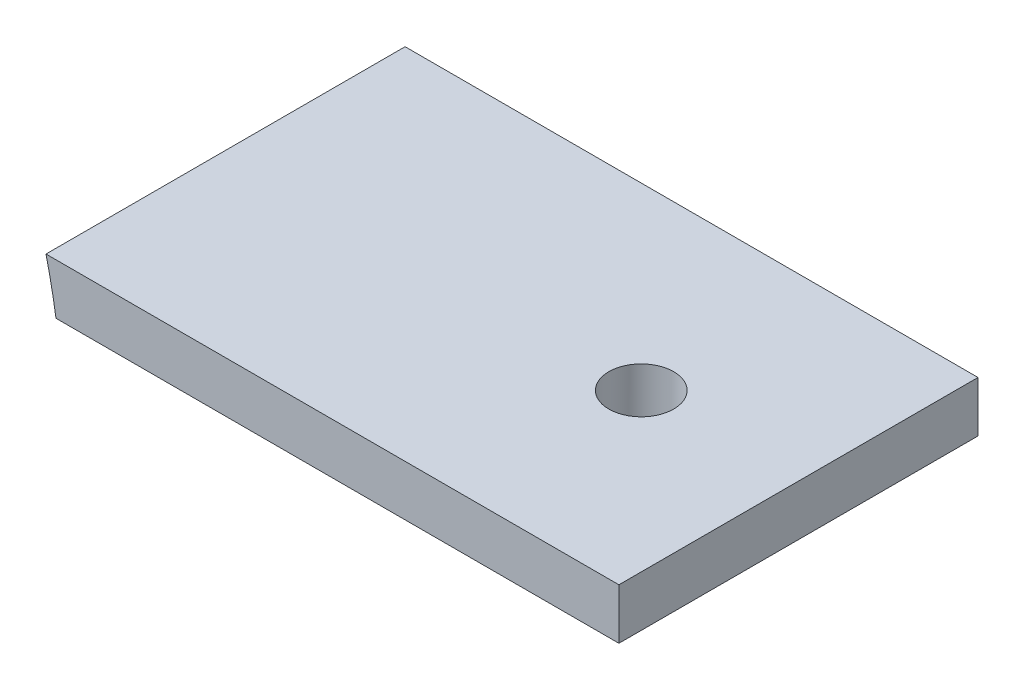
ISO-10303-21;
HEADER;
FILE_DESCRIPTION(('STEP AP214'),'2;1');
FILE_NAME('part.step','',(''),(''),'','','');
FILE_SCHEMA(('AUTOMOTIVE_DESIGN { 1 0 10303 214 1 1 1 1 }'));
ENDSEC;
DATA;
#1=APPLICATION_CONTEXT('core data for automotive mechanical design processes');
#2=APPLICATION_PROTOCOL_DEFINITION('international standard','automotive_design',2000,#1);
#3=PRODUCT_CONTEXT('',#1,'mechanical');
#4=PRODUCT('Part','Part','',(#3));
#5=PRODUCT_RELATED_PRODUCT_CATEGORY('part','',(#4));
#6=PRODUCT_DEFINITION_FORMATION('','',#4);
#7=PRODUCT_DEFINITION_CONTEXT('part definition',#1,'design');
#8=PRODUCT_DEFINITION('design','',#6,#7);
#9=PRODUCT_DEFINITION_SHAPE('','',#8);
#10=(LENGTH_UNIT() NAMED_UNIT(*) SI_UNIT(.MILLI.,.METRE.));
#11=(NAMED_UNIT(*) PLANE_ANGLE_UNIT() SI_UNIT($,.RADIAN.));
#12=(NAMED_UNIT(*) SI_UNIT($,.STERADIAN.) SOLID_ANGLE_UNIT());
#13=UNCERTAINTY_MEASURE_WITH_UNIT(LENGTH_MEASURE(1.E-05),#10,'distance_accuracy_value','');
#14=(GEOMETRIC_REPRESENTATION_CONTEXT(3) GLOBAL_UNCERTAINTY_ASSIGNED_CONTEXT((#13)) GLOBAL_UNIT_ASSIGNED_CONTEXT((#10,
#11,#12)) REPRESENTATION_CONTEXT('',''));
#15=CARTESIAN_POINT('',(0.,0.,0.));
#16=DIRECTION('',(0.,0.,1.));
#17=DIRECTION('',(1.,0.,0.));
#18=AXIS2_PLACEMENT_3D('',#15,#16,#17);
#19=CARTESIAN_POINT('',(25.7794462528693,25.5,-2.96595119095855));
#20=DIRECTION('',(0.,1.,0.));
#21=DIRECTION('',(0.,0.,1.));
#22=AXIS2_PLACEMENT_3D('',#19,#20,#21);
#23=CYLINDRICAL_SURFACE('',#22,0.799999999999999);
#24=CARTESIAN_POINT('',(25.7794462528693,24.25,-2.96595119095855));
#25=DIRECTION('',(0.,1.,0.));
#26=DIRECTION('',(-1.,0.,0.));
#27=AXIS2_PLACEMENT_3D('',#24,#25,#26);
#28=CIRCLE('',#27,0.799999999999999);
#29=CARTESIAN_POINT('',(24.9794462528693,24.25,-2.96595119095855));
#30=VERTEX_POINT('',#29);
#31=EDGE_CURVE('E107',#30,#30,#28,.F.);
#32=ORIENTED_EDGE('',*,*,#31,.T.);
#33=EDGE_LOOP('',(#32));
#34=FACE_BOUND('',#33,.T.);
#35=CARTESIAN_POINT('',(25.7794462528693,25.5,-2.96595119095855));
#36=DIRECTION('',(0.,1.,0.));
#37=DIRECTION('',(0.,0.,1.));
#38=AXIS2_PLACEMENT_3D('',#35,#36,#37);
#39=CIRCLE('',#38,0.799999999999999);
#40=CARTESIAN_POINT('',(25.7794462528693,25.5,-2.16595119095855));
#41=VERTEX_POINT('',#40);
#42=EDGE_CURVE('E104',#41,#41,#39,.T.);
#43=ORIENTED_EDGE('',*,*,#42,.T.);
#44=EDGE_LOOP('',(#43));
#45=FACE_BOUND('',#44,.T.);
#46=ADVANCED_FACE('F36',(#34,#45),#23,.F.);
#47=CARTESIAN_POINT('',(29.656098874284,20.5,291556.514563107));
#48=DIRECTION('',(1.,0.,0.));
#49=DIRECTION('',(0.,0.,-1.));
#50=AXIS2_PLACEMENT_3D('',#47,#48,#49);
#51=PLANE('',#50);
#52=DIRECTION('',(0.,0.,1.));
#53=VECTOR('',#52,1.);
#54=CARTESIAN_POINT('',(29.656098874284,24.25,291556.514563107));
#55=LINE('',#54,#53);
#56=CARTESIAN_POINT('',(29.656098874284,24.25,-7.39382756529494));
#57=VERTEX_POINT('',#56);
#58=CARTESIAN_POINT('',(29.656098874284,24.25,1.46192518337784));
#59=VERTEX_POINT('',#58);
#60=EDGE_CURVE('E73',#57,#59,#55,.T.);
#61=ORIENTED_EDGE('',*,*,#60,.F.);
#62=DIRECTION('',(0.,1.,0.));
#63=VECTOR('',#62,1.);
#64=CARTESIAN_POINT('',(29.656098874284,20.5,-7.39382756529494));
#65=LINE('',#64,#63);
#66=CARTESIAN_POINT('',(29.656098874284,25.5,-7.39382756529494));
#67=VERTEX_POINT('',#66);
#68=EDGE_CURVE('E91',#57,#67,#65,.T.);
#69=ORIENTED_EDGE('',*,*,#68,.T.);
#70=DIRECTION('',(0.,0.,-1.));
#71=VECTOR('',#70,1.);
#72=CARTESIAN_POINT('',(29.656098874284,25.5,291556.514563107));
#73=LINE('',#72,#71);
#74=CARTESIAN_POINT('',(29.656098874284,25.5,1.46192518337784));
#75=VERTEX_POINT('',#74);
#76=EDGE_CURVE('E89',#75,#67,#73,.T.);
#77=ORIENTED_EDGE('',*,*,#76,.F.);
#78=DIRECTION('',(0.,1.,0.));
#79=VECTOR('',#78,1.);
#80=CARTESIAN_POINT('',(29.656098874284,20.5,1.46192518337784));
#81=LINE('',#80,#79);
#82=EDGE_CURVE('E81',#59,#75,#81,.T.);
#83=ORIENTED_EDGE('',*,*,#82,.F.);
#84=EDGE_LOOP('',(#61,#69,#77,#83));
#85=FACE_BOUND('',#84,.T.);
#86=ADVANCED_FACE('F90',(#85),#51,.T.);
#87=CARTESIAN_POINT('',(0.,25.5,0.));
#88=DIRECTION('',(0.,-1.,0.));
#89=DIRECTION('',(0.,0.,-1.));
#90=AXIS2_PLACEMENT_3D('',#87,#88,#89);
#91=PLANE('',#90);
#92=ORIENTED_EDGE('',*,*,#76,.T.);
#93=DIRECTION('',(1.,0.,0.));
#94=VECTOR('',#93,1.);
#95=CARTESIAN_POINT('',(-400002.038834951,25.5,-7.39382756529494));
#96=LINE('',#95,#94);
#97=CARTESIAN_POINT('',(15.5272734313179,25.5,-7.39382756529494));
#98=VERTEX_POINT('',#97);
#99=EDGE_CURVE('E86',#98,#67,#96,.T.);
#100=ORIENTED_EDGE('',*,*,#99,.F.);
#101=DIRECTION('',(0.,0.,-1.));
#102=VECTOR('',#101,1.);
#103=CARTESIAN_POINT('',(15.5272734313179,25.5,3.56748567590681));
#104=LINE('',#103,#102);
#105=CARTESIAN_POINT('',(15.5272734313179,25.5,1.46192518337784));
#106=VERTEX_POINT('',#105);
#107=EDGE_CURVE('E46',#106,#98,#104,.T.);
#108=ORIENTED_EDGE('',*,*,#107,.F.);
#109=DIRECTION('',(1.,0.,0.));
#110=VECTOR('',#109,1.);
#111=CARTESIAN_POINT('',(-400002.038834951,25.5,1.46192518337784));
#112=LINE('',#111,#110);
#113=EDGE_CURVE('E54',#106,#75,#112,.T.);
#114=ORIENTED_EDGE('',*,*,#113,.T.);
#115=EDGE_LOOP('',(#92,#100,#108,#114));
#116=FACE_BOUND('',#115,.T.);
#117=ORIENTED_EDGE('',*,*,#42,.F.);
#118=EDGE_LOOP('',(#117));
#119=FACE_BOUND('',#118,.T.);
#120=ADVANCED_FACE('F95',(#116,#119),#91,.F.);
#121=CARTESIAN_POINT('',(-400002.038834951,20.5,-7.39382756529494));
#122=DIRECTION('',(0.,0.,1.));
#123=DIRECTION('',(1.,0.,0.));
#124=AXIS2_PLACEMENT_3D('',#121,#122,#123);
#125=PLANE('',#124);
#126=ORIENTED_EDGE('',*,*,#68,.F.);
#127=DIRECTION('',(-1.,0.,0.));
#128=VECTOR('',#127,1.);
#129=CARTESIAN_POINT('',(-400002.038834951,24.2499999998934,-7.39382756529494));
#130=LINE('',#129,#128);
#131=CARTESIAN_POINT('',(15.7738641555528,24.25,-7.39382756529494));
#132=VERTEX_POINT('',#131);
#133=EDGE_CURVE('E68',#57,#132,#130,.T.);
#134=ORIENTED_EDGE('',*,*,#133,.T.);
#135=CARTESIAN_POINT('',(-0.0344541676912807,21.7807750626998,-7.39382756529494));
#136=DIRECTION('',(0.,0.,-1.));
#137=DIRECTION('',(-1.,0.,0.));
#138=AXIS2_PLACEMENT_3D('',#135,#136,#137);
#139=CIRCLE('',#138,16.);
#140=EDGE_CURVE('E11',#98,#132,#139,.T.);
#141=ORIENTED_EDGE('',*,*,#140,.F.);
#142=ORIENTED_EDGE('',*,*,#99,.T.);
#143=EDGE_LOOP('',(#126,#134,#141,#142));
#144=FACE_BOUND('',#143,.T.);
#145=ADVANCED_FACE('F119',(#144),#125,.F.);
#146=CARTESIAN_POINT('',(-400002.038834951,20.5,1.46192518337784));
#147=DIRECTION('',(0.,0.,1.));
#148=DIRECTION('',(1.,0.,0.));
#149=AXIS2_PLACEMENT_3D('',#146,#147,#148);
#150=PLANE('',#149);
#151=DIRECTION('',(-1.,0.,0.));
#152=VECTOR('',#151,1.);
#153=CARTESIAN_POINT('',(-400002.038834951,24.2499999998934,1.46192518337784));
#154=LINE('',#153,#152);
#155=CARTESIAN_POINT('',(15.7738641555528,24.25,1.46192518337784));
#156=VERTEX_POINT('',#155);
#157=EDGE_CURVE('E84',#59,#156,#154,.T.);
#158=ORIENTED_EDGE('',*,*,#157,.F.);
#159=ORIENTED_EDGE('',*,*,#82,.T.);
#160=ORIENTED_EDGE('',*,*,#113,.F.);
#161=CARTESIAN_POINT('',(-0.0344541676912807,21.7807750626998,1.46192518337784));
#162=DIRECTION('',(0.,0.,1.));
#163=DIRECTION('',(1.,0.,0.));
#164=AXIS2_PLACEMENT_3D('',#161,#162,#163);
#165=CIRCLE('',#164,16.);
#166=EDGE_CURVE('E113',#156,#106,#165,.T.);
#167=ORIENTED_EDGE('',*,*,#166,.F.);
#168=EDGE_LOOP('',(#158,#159,#160,#167));
#169=FACE_BOUND('',#168,.T.);
#170=ADVANCED_FACE('F83',(#169),#150,.T.);
#171=CARTESIAN_POINT('',(-34.2277855679569,24.25,-40.4854368932039));
#172=DIRECTION('',(0.,1.,0.));
#173=DIRECTION('',(-1.,0.,0.));
#174=AXIS2_PLACEMENT_3D('',#171,#172,#173);
#175=PLANE('',#174);
#176=ORIENTED_EDGE('',*,*,#157,.T.);
#177=DIRECTION('',(0.,0.,-1.));
#178=VECTOR('',#177,1.);
#179=CARTESIAN_POINT('',(15.7738641555528,24.25,3.56748567590681));
#180=LINE('',#179,#178);
#181=EDGE_CURVE('E40',#156,#132,#180,.T.);
#182=ORIENTED_EDGE('',*,*,#181,.T.);
#183=ORIENTED_EDGE('',*,*,#133,.F.);
#184=ORIENTED_EDGE('',*,*,#60,.T.);
#185=EDGE_LOOP('',(#176,#182,#183,#184));
#186=FACE_BOUND('',#185,.T.);
#187=ORIENTED_EDGE('',*,*,#31,.F.);
#188=EDGE_LOOP('',(#187));
#189=FACE_BOUND('',#188,.T.);
#190=ADVANCED_FACE('F117',(#186,#189),#175,.F.);
#191=CARTESIAN_POINT('',(-0.0344541676912807,21.7807750626998,3.56748567590681));
#192=DIRECTION('',(0.,0.,-1.));
#193=DIRECTION('',(-1.,0.,0.));
#194=AXIS2_PLACEMENT_3D('',#191,#192,#193);
#195=CYLINDRICAL_SURFACE('',#194,16.);
#196=ORIENTED_EDGE('',*,*,#181,.F.);
#197=ORIENTED_EDGE('',*,*,#166,.T.);
#198=ORIENTED_EDGE('',*,*,#107,.T.);
#199=ORIENTED_EDGE('',*,*,#140,.T.);
#200=EDGE_LOOP('',(#196,#197,#198,#199));
#201=FACE_BOUND('',#200,.T.);
#202=ADVANCED_FACE('F38',(#201),#195,.F.);
#203=CLOSED_SHELL('',(#46,#86,#120,#145,#170,#190,#202));
#204=MANIFOLD_SOLID_BREP('B2',#203);
#205=ADVANCED_BREP_SHAPE_REPRESENTATION('',(#18,#204),#14);
#206=SHAPE_DEFINITION_REPRESENTATION(#9,#205);
ENDSEC;
END-ISO-10303-21;
